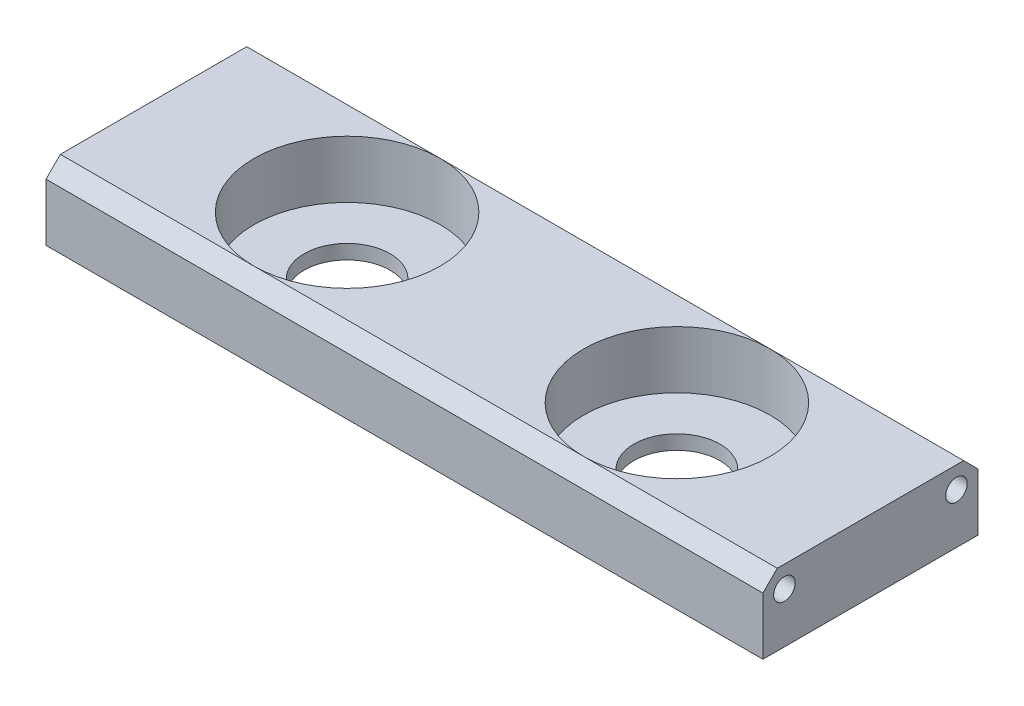
ISO-10303-21;
HEADER;
FILE_DESCRIPTION(('STEP AP214'),'2;1');
FILE_NAME('part.step','',(''),(''),'','','');
FILE_SCHEMA(('AUTOMOTIVE_DESIGN { 1 0 10303 214 1 1 1 1 }'));
ENDSEC;
DATA;
#1=APPLICATION_CONTEXT('core data for automotive mechanical design processes');
#2=APPLICATION_PROTOCOL_DEFINITION('international standard','automotive_design',2000,#1);
#3=PRODUCT_CONTEXT('',#1,'mechanical');
#4=PRODUCT('Part','Part','',(#3));
#5=PRODUCT_RELATED_PRODUCT_CATEGORY('part','',(#4));
#6=PRODUCT_DEFINITION_FORMATION('','',#4);
#7=PRODUCT_DEFINITION_CONTEXT('part definition',#1,'design');
#8=PRODUCT_DEFINITION('design','',#6,#7);
#9=PRODUCT_DEFINITION_SHAPE('','',#8);
#10=(LENGTH_UNIT() NAMED_UNIT(*) SI_UNIT(.MILLI.,.METRE.));
#11=(NAMED_UNIT(*) PLANE_ANGLE_UNIT() SI_UNIT($,.RADIAN.));
#12=(NAMED_UNIT(*) SI_UNIT($,.STERADIAN.) SOLID_ANGLE_UNIT());
#13=UNCERTAINTY_MEASURE_WITH_UNIT(LENGTH_MEASURE(1.E-05),#10,'distance_accuracy_value','');
#14=(GEOMETRIC_REPRESENTATION_CONTEXT(3) GLOBAL_UNCERTAINTY_ASSIGNED_CONTEXT((#13)) GLOBAL_UNIT_ASSIGNED_CONTEXT((#10,
#11,#12)) REPRESENTATION_CONTEXT('',''));
#15=CARTESIAN_POINT('',(0.,0.,0.));
#16=DIRECTION('',(0.,0.,1.));
#17=DIRECTION('',(1.,0.,0.));
#18=AXIS2_PLACEMENT_3D('',#15,#16,#17);
#19=CARTESIAN_POINT('',(0.,6.,0.));
#20=DIRECTION('',(0.,-1.,0.));
#21=DIRECTION('',(0.,0.,-1.));
#22=AXIS2_PLACEMENT_3D('',#19,#20,#21);
#23=PLANE('',#22);
#24=CARTESIAN_POINT('',(27.,6.,-15.));
#25=DIRECTION('',(0.,1.,0.));
#26=DIRECTION('',(0.,0.,1.));
#27=AXIS2_PLACEMENT_3D('',#24,#25,#26);
#28=CIRCLE('',#27,13.);
#29=CARTESIAN_POINT('',(27.,6.,-2.));
#30=VERTEX_POINT('',#29);
#31=CARTESIAN_POINT('',(27.,6.,-28.));
#32=VERTEX_POINT('',#31);
#33=EDGE_CURVE('E61',#30,#32,#28,.T.);
#34=ORIENTED_EDGE('',*,*,#33,.F.);
#35=DIRECTION('',(1.,0.,0.));
#36=VECTOR('',#35,1.);
#37=CARTESIAN_POINT('',(0.,6.,-2.));
#38=LINE('',#37,#36);
#39=CARTESIAN_POINT('',(73.,6.,-2.));
#40=VERTEX_POINT('',#39);
#41=EDGE_CURVE('E138',#30,#40,#38,.T.);
#42=ORIENTED_EDGE('',*,*,#41,.T.);
#43=CARTESIAN_POINT('',(73.,6.,-15.));
#44=DIRECTION('',(0.,1.,0.));
#45=DIRECTION('',(0.,0.,1.));
#46=AXIS2_PLACEMENT_3D('',#43,#44,#45);
#47=CIRCLE('',#46,13.);
#48=CARTESIAN_POINT('',(73.,6.,-28.));
#49=VERTEX_POINT('',#48);
#50=EDGE_CURVE('E115',#49,#40,#47,.T.);
#51=ORIENTED_EDGE('',*,*,#50,.F.);
#52=DIRECTION('',(-1.,0.,0.));
#53=VECTOR('',#52,1.);
#54=CARTESIAN_POINT('',(0.,6.,-28.));
#55=LINE('',#54,#53);
#56=EDGE_CURVE('E152',#49,#32,#55,.T.);
#57=ORIENTED_EDGE('',*,*,#56,.T.);
#58=EDGE_LOOP('',(#34,#42,#51,#57));
#59=FACE_BOUND('',#58,.T.);
#60=ADVANCED_FACE('F50',(#59),#23,.F.);
#61=EDGE_CURVE('E75',#40,#49,#47,.T.);
#62=ORIENTED_EDGE('',*,*,#61,.F.);
#63=CARTESIAN_POINT('',(100.,6.,-2.));
#64=VERTEX_POINT('',#63);
#65=EDGE_CURVE('E127',#40,#64,#38,.T.);
#66=ORIENTED_EDGE('',*,*,#65,.T.);
#67=DIRECTION('',(0.,0.,-1.));
#68=VECTOR('',#67,1.);
#69=CARTESIAN_POINT('',(100.,6.,0.));
#70=LINE('',#69,#68);
#71=CARTESIAN_POINT('',(100.,6.,-28.));
#72=VERTEX_POINT('',#71);
#73=EDGE_CURVE('E241',#64,#72,#70,.T.);
#74=ORIENTED_EDGE('',*,*,#73,.T.);
#75=EDGE_CURVE('E129',#72,#49,#55,.T.);
#76=ORIENTED_EDGE('',*,*,#75,.T.);
#77=EDGE_LOOP('',(#62,#66,#74,#76));
#78=FACE_BOUND('',#77,.T.);
#79=ADVANCED_FACE('F124',(#78),#23,.F.);
#80=CARTESIAN_POINT('',(73.,0.,-15.));
#81=DIRECTION('',(0.,1.,0.));
#82=DIRECTION('',(0.,0.,1.));
#83=AXIS2_PLACEMENT_3D('',#80,#81,#82);
#84=CYLINDRICAL_SURFACE('',#83,6.);
#85=CARTESIAN_POINT('',(73.,-4.,-15.));
#86=DIRECTION('',(0.,-1.,0.));
#87=DIRECTION('',(0.,0.,-1.));
#88=AXIS2_PLACEMENT_3D('',#85,#86,#87);
#89=CIRCLE('',#88,6.);
#90=CARTESIAN_POINT('',(73.,-4.,-21.));
#91=VERTEX_POINT('',#90);
#92=EDGE_CURVE('E171',#91,#91,#89,.T.);
#93=ORIENTED_EDGE('',*,*,#92,.T.);
#94=EDGE_LOOP('',(#93));
#95=FACE_BOUND('',#94,.T.);
#96=CARTESIAN_POINT('',(73.,-2.,-15.));
#97=DIRECTION('',(0.,1.,0.));
#98=DIRECTION('',(0.,0.,1.));
#99=AXIS2_PLACEMENT_3D('',#96,#97,#98);
#100=CIRCLE('',#99,6.);
#101=CARTESIAN_POINT('',(73.,-2.,-9.));
#102=VERTEX_POINT('',#101);
#103=EDGE_CURVE('E55',#102,#102,#100,.F.);
#104=ORIENTED_EDGE('',*,*,#103,.F.);
#105=EDGE_LOOP('',(#104));
#106=FACE_BOUND('',#105,.T.);
#107=ADVANCED_FACE('F307',(#95,#106),#84,.F.);
#108=CARTESIAN_POINT('',(27.,0.,-15.));
#109=DIRECTION('',(0.,1.,0.));
#110=DIRECTION('',(0.,0.,1.));
#111=AXIS2_PLACEMENT_3D('',#108,#109,#110);
#112=CYLINDRICAL_SURFACE('',#111,5.99999999999999);
#113=CARTESIAN_POINT('',(27.,-4.,-15.));
#114=DIRECTION('',(0.,-1.,0.));
#115=DIRECTION('',(0.,0.,-1.));
#116=AXIS2_PLACEMENT_3D('',#113,#114,#115);
#117=CIRCLE('',#116,5.99999999999999);
#118=CARTESIAN_POINT('',(27.,-4.,-21.));
#119=VERTEX_POINT('',#118);
#120=EDGE_CURVE('E190',#119,#119,#117,.T.);
#121=ORIENTED_EDGE('',*,*,#120,.T.);
#122=EDGE_LOOP('',(#121));
#123=FACE_BOUND('',#122,.T.);
#124=CARTESIAN_POINT('',(27.,-2.,-15.));
#125=DIRECTION('',(0.,1.,0.));
#126=DIRECTION('',(0.,0.,1.));
#127=AXIS2_PLACEMENT_3D('',#124,#125,#126);
#128=CIRCLE('',#127,5.99999999999999);
#129=CARTESIAN_POINT('',(27.,-2.,-9.00000000000001));
#130=VERTEX_POINT('',#129);
#131=EDGE_CURVE('E167',#130,#130,#128,.F.);
#132=ORIENTED_EDGE('',*,*,#131,.F.);
#133=EDGE_LOOP('',(#132));
#134=FACE_BOUND('',#133,.T.);
#135=ADVANCED_FACE('F324',(#123,#134),#112,.F.);
#136=CARTESIAN_POINT('',(0.,6.,0.));
#137=DIRECTION('',(1.,0.,0.));
#138=DIRECTION('',(0.,0.,-1.));
#139=AXIS2_PLACEMENT_3D('',#136,#137,#138);
#140=PLANE('',#139);
#141=CARTESIAN_POINT('',(0.,3.,-27.));
#142=DIRECTION('',(-1.,0.,0.));
#143=DIRECTION('',(0.,0.,1.));
#144=AXIS2_PLACEMENT_3D('',#141,#142,#143);
#145=CIRCLE('',#144,1.5);
#146=CARTESIAN_POINT('',(0.,3.,-25.5));
#147=VERTEX_POINT('',#146);
#148=EDGE_CURVE('E214',#147,#147,#145,.T.);
#149=ORIENTED_EDGE('',*,*,#148,.F.);
#150=EDGE_LOOP('',(#149));
#151=FACE_BOUND('',#150,.T.);
#152=CARTESIAN_POINT('',(0.,3.,-3.));
#153=DIRECTION('',(-1.,0.,0.));
#154=DIRECTION('',(0.,0.,1.));
#155=AXIS2_PLACEMENT_3D('',#152,#153,#154);
#156=CIRCLE('',#155,1.5);
#157=CARTESIAN_POINT('',(0.,3.,-1.5));
#158=VERTEX_POINT('',#157);
#159=EDGE_CURVE('E218',#158,#158,#156,.T.);
#160=ORIENTED_EDGE('',*,*,#159,.F.);
#161=EDGE_LOOP('',(#160));
#162=FACE_BOUND('',#161,.T.);
#163=DIRECTION('',(0.,0.,1.));
#164=VECTOR('',#163,1.);
#165=CARTESIAN_POINT('',(0.,6.,0.));
#166=LINE('',#165,#164);
#167=CARTESIAN_POINT('',(0.,6.,-28.));
#168=VERTEX_POINT('',#167);
#169=CARTESIAN_POINT('',(0.,6.,-2.));
#170=VERTEX_POINT('',#169);
#171=EDGE_CURVE('E226',#168,#170,#166,.T.);
#172=ORIENTED_EDGE('',*,*,#171,.F.);
#173=DIRECTION('',(0.,0.70710678118655,0.707106781186545));
#174=VECTOR('',#173,1.);
#175=CARTESIAN_POINT('',(0.,6.,-28.));
#176=LINE('',#175,#174);
#177=CARTESIAN_POINT('',(0.,4.,-30.));
#178=VERTEX_POINT('',#177);
#179=EDGE_CURVE('E160',#168,#178,#176,.F.);
#180=ORIENTED_EDGE('',*,*,#179,.T.);
#181=DIRECTION('',(0.,-1.,0.));
#182=VECTOR('',#181,1.);
#183=CARTESIAN_POINT('',(0.,6.,-30.));
#184=LINE('',#183,#182);
#185=CARTESIAN_POINT('',(0.,-4.,-30.));
#186=VERTEX_POINT('',#185);
#187=EDGE_CURVE('E246',#178,#186,#184,.T.);
#188=ORIENTED_EDGE('',*,*,#187,.T.);
#189=DIRECTION('',(0.,0.,-1.));
#190=VECTOR('',#189,1.);
#191=CARTESIAN_POINT('',(0.,-4.,0.));
#192=LINE('',#191,#190);
#193=CARTESIAN_POINT('',(0.,-4.,0.));
#194=VERTEX_POINT('',#193);
#195=EDGE_CURVE('E191',#194,#186,#192,.T.);
#196=ORIENTED_EDGE('',*,*,#195,.F.);
#197=DIRECTION('',(0.,-1.,0.));
#198=VECTOR('',#197,1.);
#199=CARTESIAN_POINT('',(0.,6.,0.));
#200=LINE('',#199,#198);
#201=CARTESIAN_POINT('',(0.,3.99999999999998,0.));
#202=VERTEX_POINT('',#201);
#203=EDGE_CURVE('E142',#202,#194,#200,.T.);
#204=ORIENTED_EDGE('',*,*,#203,.F.);
#205=DIRECTION('',(0.,-0.70710678118655,0.707106781186545));
#206=VECTOR('',#205,1.);
#207=CARTESIAN_POINT('',(0.,6.,-2.));
#208=LINE('',#207,#206);
#209=EDGE_CURVE('E153',#202,#170,#208,.F.);
#210=ORIENTED_EDGE('',*,*,#209,.T.);
#211=EDGE_LOOP('',(#172,#180,#188,#196,#204,#210));
#212=FACE_BOUND('',#211,.T.);
#213=ADVANCED_FACE('F267',(#151,#162,#212),#140,.F.);
#214=CARTESIAN_POINT('',(0.,6.,0.));
#215=DIRECTION('',(0.,0.,-1.));
#216=DIRECTION('',(-1.,0.,0.));
#217=AXIS2_PLACEMENT_3D('',#214,#215,#216);
#218=PLANE('',#217);
#219=DIRECTION('',(0.,-1.,0.));
#220=VECTOR('',#219,1.);
#221=CARTESIAN_POINT('',(100.,6.,0.));
#222=LINE('',#221,#220);
#223=CARTESIAN_POINT('',(100.,3.99999999999998,0.));
#224=VERTEX_POINT('',#223);
#225=CARTESIAN_POINT('',(100.,-4.,0.));
#226=VERTEX_POINT('',#225);
#227=EDGE_CURVE('E251',#224,#226,#222,.T.);
#228=ORIENTED_EDGE('',*,*,#227,.F.);
#229=DIRECTION('',(-1.,0.,0.));
#230=VECTOR('',#229,1.);
#231=CARTESIAN_POINT('',(0.,3.99999999999998,0.));
#232=LINE('',#231,#230);
#233=EDGE_CURVE('E11',#224,#202,#232,.T.);
#234=ORIENTED_EDGE('',*,*,#233,.T.);
#235=ORIENTED_EDGE('',*,*,#203,.T.);
#236=DIRECTION('',(-1.,0.,0.));
#237=VECTOR('',#236,1.);
#238=CARTESIAN_POINT('',(0.,-4.,0.));
#239=LINE('',#238,#237);
#240=EDGE_CURVE('E202',#226,#194,#239,.T.);
#241=ORIENTED_EDGE('',*,*,#240,.F.);
#242=EDGE_LOOP('',(#228,#234,#235,#241));
#243=FACE_BOUND('',#242,.T.);
#244=ADVANCED_FACE('F265',(#243),#218,.F.);
#245=CARTESIAN_POINT('',(100.,6.,0.));
#246=DIRECTION('',(-1.,0.,0.));
#247=DIRECTION('',(0.,0.,1.));
#248=AXIS2_PLACEMENT_3D('',#245,#246,#247);
#249=PLANE('',#248);
#250=CARTESIAN_POINT('',(100.,3.,-3.));
#251=DIRECTION('',(1.,0.,0.));
#252=DIRECTION('',(0.,0.,-1.));
#253=AXIS2_PLACEMENT_3D('',#250,#251,#252);
#254=CIRCLE('',#253,1.5);
#255=CARTESIAN_POINT('',(100.,3.,-4.5));
#256=VERTEX_POINT('',#255);
#257=EDGE_CURVE('E233',#256,#256,#254,.T.);
#258=ORIENTED_EDGE('',*,*,#257,.F.);
#259=EDGE_LOOP('',(#258));
#260=FACE_BOUND('',#259,.T.);
#261=CARTESIAN_POINT('',(100.,3.,-27.));
#262=DIRECTION('',(1.,0.,0.));
#263=DIRECTION('',(0.,0.,-1.));
#264=AXIS2_PLACEMENT_3D('',#261,#262,#263);
#265=CIRCLE('',#264,1.5);
#266=CARTESIAN_POINT('',(100.,3.,-28.5));
#267=VERTEX_POINT('',#266);
#268=EDGE_CURVE('E232',#267,#267,#265,.T.);
#269=ORIENTED_EDGE('',*,*,#268,.F.);
#270=EDGE_LOOP('',(#269));
#271=FACE_BOUND('',#270,.T.);
#272=DIRECTION('',(0.,-1.,0.));
#273=VECTOR('',#272,1.);
#274=CARTESIAN_POINT('',(100.,6.,-30.));
#275=LINE('',#274,#273);
#276=CARTESIAN_POINT('',(100.,4.,-30.));
#277=VERTEX_POINT('',#276);
#278=CARTESIAN_POINT('',(100.,-4.,-30.));
#279=VERTEX_POINT('',#278);
#280=EDGE_CURVE('E253',#277,#279,#275,.T.);
#281=ORIENTED_EDGE('',*,*,#280,.F.);
#282=DIRECTION('',(0.,-0.70710678118655,-0.707106781186545));
#283=VECTOR('',#282,1.);
#284=CARTESIAN_POINT('',(100.,6.,-28.));
#285=LINE('',#284,#283);
#286=EDGE_CURVE('E59',#277,#72,#285,.F.);
#287=ORIENTED_EDGE('',*,*,#286,.T.);
#288=ORIENTED_EDGE('',*,*,#73,.F.);
#289=DIRECTION('',(0.,0.70710678118655,-0.707106781186545));
#290=VECTOR('',#289,1.);
#291=CARTESIAN_POINT('',(100.,6.,-2.));
#292=LINE('',#291,#290);
#293=EDGE_CURVE('E139',#64,#224,#292,.F.);
#294=ORIENTED_EDGE('',*,*,#293,.T.);
#295=ORIENTED_EDGE('',*,*,#227,.T.);
#296=DIRECTION('',(0.,0.,1.));
#297=VECTOR('',#296,1.);
#298=CARTESIAN_POINT('',(100.,-4.,0.));
#299=LINE('',#298,#297);
#300=EDGE_CURVE('E203',#279,#226,#299,.T.);
#301=ORIENTED_EDGE('',*,*,#300,.F.);
#302=EDGE_LOOP('',(#281,#287,#288,#294,#295,#301));
#303=FACE_BOUND('',#302,.T.);
#304=ADVANCED_FACE('F280',(#260,#271,#303),#249,.F.);
#305=CARTESIAN_POINT('',(0.,6.,-30.));
#306=DIRECTION('',(0.,0.,1.));
#307=DIRECTION('',(1.,0.,0.));
#308=AXIS2_PLACEMENT_3D('',#305,#306,#307);
#309=PLANE('',#308);
#310=ORIENTED_EDGE('',*,*,#187,.F.);
#311=DIRECTION('',(1.,0.,0.));
#312=VECTOR('',#311,1.);
#313=CARTESIAN_POINT('',(0.,4.,-30.));
#314=LINE('',#313,#312);
#315=EDGE_CURVE('E159',#178,#277,#314,.T.);
#316=ORIENTED_EDGE('',*,*,#315,.T.);
#317=ORIENTED_EDGE('',*,*,#280,.T.);
#318=DIRECTION('',(1.,0.,0.));
#319=VECTOR('',#318,1.);
#320=CARTESIAN_POINT('',(0.,-4.,-30.));
#321=LINE('',#320,#319);
#322=EDGE_CURVE('E197',#186,#279,#321,.T.);
#323=ORIENTED_EDGE('',*,*,#322,.F.);
#324=EDGE_LOOP('',(#310,#316,#317,#323));
#325=FACE_BOUND('',#324,.T.);
#326=ADVANCED_FACE('F274',(#325),#309,.F.);
#327=EDGE_CURVE('E133',#32,#30,#28,.T.);
#328=ORIENTED_EDGE('',*,*,#327,.F.);
#329=EDGE_CURVE('E150',#32,#168,#55,.T.);
#330=ORIENTED_EDGE('',*,*,#329,.T.);
#331=ORIENTED_EDGE('',*,*,#171,.T.);
#332=EDGE_CURVE('E145',#170,#30,#38,.T.);
#333=ORIENTED_EDGE('',*,*,#332,.T.);
#334=EDGE_LOOP('',(#328,#330,#331,#333));
#335=FACE_BOUND('',#334,.T.);
#336=ADVANCED_FACE('F281',(#335),#23,.F.);
#337=CARTESIAN_POINT('',(0.,6.,-28.));
#338=DIRECTION('',(0.,-0.707106781186545,0.70710678118655));
#339=DIRECTION('',(-1.,0.,0.));
#340=AXIS2_PLACEMENT_3D('',#337,#338,#339);
#341=PLANE('',#340);
#342=ORIENTED_EDGE('',*,*,#286,.F.);
#343=ORIENTED_EDGE('',*,*,#315,.F.);
#344=ORIENTED_EDGE('',*,*,#179,.F.);
#345=ORIENTED_EDGE('',*,*,#329,.F.);
#346=ORIENTED_EDGE('',*,*,#56,.F.);
#347=ORIENTED_EDGE('',*,*,#75,.F.);
#348=EDGE_LOOP('',(#342,#343,#344,#345,#346,#347));
#349=FACE_BOUND('',#348,.T.);
#350=ADVANCED_FACE('F278',(#349),#341,.F.);
#351=CARTESIAN_POINT('',(0.,6.,-2.));
#352=DIRECTION('',(0.,-0.707106781186545,-0.70710678118655));
#353=DIRECTION('',(1.,0.,0.));
#354=AXIS2_PLACEMENT_3D('',#351,#352,#353);
#355=PLANE('',#354);
#356=ORIENTED_EDGE('',*,*,#209,.F.);
#357=ORIENTED_EDGE('',*,*,#233,.F.);
#358=ORIENTED_EDGE('',*,*,#293,.F.);
#359=ORIENTED_EDGE('',*,*,#65,.F.);
#360=ORIENTED_EDGE('',*,*,#41,.F.);
#361=ORIENTED_EDGE('',*,*,#332,.F.);
#362=EDGE_LOOP('',(#356,#357,#358,#359,#360,#361));
#363=FACE_BOUND('',#362,.T.);
#364=ADVANCED_FACE('F49',(#363),#355,.F.);
#365=CARTESIAN_POINT('',(93.,3.,-27.));
#366=DIRECTION('',(1.,0.,0.));
#367=DIRECTION('',(0.,0.,-1.));
#368=AXIS2_PLACEMENT_3D('',#365,#366,#367);
#369=CYLINDRICAL_SURFACE('',#368,1.5);
#370=CARTESIAN_POINT('',(93.,3.,-27.));
#371=DIRECTION('',(1.,0.,0.));
#372=DIRECTION('',(0.,0.,-1.));
#373=AXIS2_PLACEMENT_3D('',#370,#371,#372);
#374=CIRCLE('',#373,1.5);
#375=CARTESIAN_POINT('',(93.,3.,-28.5));
#376=VERTEX_POINT('',#375);
#377=EDGE_CURVE('E212',#376,#376,#374,.T.);
#378=ORIENTED_EDGE('',*,*,#377,.F.);
#379=EDGE_LOOP('',(#378));
#380=FACE_BOUND('',#379,.T.);
#381=ORIENTED_EDGE('',*,*,#268,.T.);
#382=EDGE_LOOP('',(#381));
#383=FACE_BOUND('',#382,.T.);
#384=ADVANCED_FACE('F364',(#380,#383),#369,.F.);
#385=CARTESIAN_POINT('',(93.,3.,-27.));
#386=DIRECTION('',(1.,0.,0.));
#387=DIRECTION('',(0.,0.,-1.));
#388=AXIS2_PLACEMENT_3D('',#385,#386,#387);
#389=PLANE('',#388);
#390=ORIENTED_EDGE('',*,*,#377,.T.);
#391=EDGE_LOOP('',(#390));
#392=FACE_BOUND('',#391,.T.);
#393=ADVANCED_FACE('F361',(#392),#389,.T.);
#394=CARTESIAN_POINT('',(93.,3.,-3.));
#395=DIRECTION('',(1.,0.,0.));
#396=DIRECTION('',(0.,0.,-1.));
#397=AXIS2_PLACEMENT_3D('',#394,#395,#396);
#398=CYLINDRICAL_SURFACE('',#397,1.5);
#399=CARTESIAN_POINT('',(93.,3.,-3.));
#400=DIRECTION('',(1.,0.,0.));
#401=DIRECTION('',(0.,0.,-1.));
#402=AXIS2_PLACEMENT_3D('',#399,#400,#401);
#403=CIRCLE('',#402,1.5);
#404=CARTESIAN_POINT('',(93.,3.,-4.5));
#405=VERTEX_POINT('',#404);
#406=EDGE_CURVE('E228',#405,#405,#403,.T.);
#407=ORIENTED_EDGE('',*,*,#406,.F.);
#408=EDGE_LOOP('',(#407));
#409=FACE_BOUND('',#408,.T.);
#410=ORIENTED_EDGE('',*,*,#257,.T.);
#411=EDGE_LOOP('',(#410));
#412=FACE_BOUND('',#411,.T.);
#413=ADVANCED_FACE('F355',(#409,#412),#398,.F.);
#414=CARTESIAN_POINT('',(93.,3.,-3.));
#415=DIRECTION('',(1.,0.,0.));
#416=DIRECTION('',(0.,0.,-1.));
#417=AXIS2_PLACEMENT_3D('',#414,#415,#416);
#418=PLANE('',#417);
#419=ORIENTED_EDGE('',*,*,#406,.T.);
#420=EDGE_LOOP('',(#419));
#421=FACE_BOUND('',#420,.T.);
#422=ADVANCED_FACE('F344',(#421),#418,.T.);
#423=CARTESIAN_POINT('',(7.,3.,-3.));
#424=DIRECTION('',(-1.,0.,0.));
#425=DIRECTION('',(0.,0.,1.));
#426=AXIS2_PLACEMENT_3D('',#423,#424,#425);
#427=CYLINDRICAL_SURFACE('',#426,1.5);
#428=CARTESIAN_POINT('',(7.,3.,-3.));
#429=DIRECTION('',(-1.,0.,0.));
#430=DIRECTION('',(0.,0.,1.));
#431=AXIS2_PLACEMENT_3D('',#428,#429,#430);
#432=CIRCLE('',#431,1.5);
#433=CARTESIAN_POINT('',(7.,3.,-1.5));
#434=VERTEX_POINT('',#433);
#435=EDGE_CURVE('E207',#434,#434,#432,.T.);
#436=ORIENTED_EDGE('',*,*,#435,.F.);
#437=EDGE_LOOP('',(#436));
#438=FACE_BOUND('',#437,.T.);
#439=ORIENTED_EDGE('',*,*,#159,.T.);
#440=EDGE_LOOP('',(#439));
#441=FACE_BOUND('',#440,.T.);
#442=ADVANCED_FACE('F343',(#438,#441),#427,.F.);
#443=CARTESIAN_POINT('',(7.,3.,-3.));
#444=DIRECTION('',(-1.,0.,0.));
#445=DIRECTION('',(0.,0.,1.));
#446=AXIS2_PLACEMENT_3D('',#443,#444,#445);
#447=PLANE('',#446);
#448=ORIENTED_EDGE('',*,*,#435,.T.);
#449=EDGE_LOOP('',(#448));
#450=FACE_BOUND('',#449,.T.);
#451=ADVANCED_FACE('F341',(#450),#447,.T.);
#452=CARTESIAN_POINT('',(7.,3.,-27.));
#453=DIRECTION('',(-1.,0.,0.));
#454=DIRECTION('',(0.,0.,1.));
#455=AXIS2_PLACEMENT_3D('',#452,#453,#454);
#456=CYLINDRICAL_SURFACE('',#455,1.5);
#457=CARTESIAN_POINT('',(7.,3.,-27.));
#458=DIRECTION('',(-1.,0.,0.));
#459=DIRECTION('',(0.,0.,1.));
#460=AXIS2_PLACEMENT_3D('',#457,#458,#459);
#461=CIRCLE('',#460,1.5);
#462=CARTESIAN_POINT('',(7.,3.,-25.5));
#463=VERTEX_POINT('',#462);
#464=EDGE_CURVE('E209',#463,#463,#461,.T.);
#465=ORIENTED_EDGE('',*,*,#464,.F.);
#466=EDGE_LOOP('',(#465));
#467=FACE_BOUND('',#466,.T.);
#468=ORIENTED_EDGE('',*,*,#148,.T.);
#469=EDGE_LOOP('',(#468));
#470=FACE_BOUND('',#469,.T.);
#471=ADVANCED_FACE('F353',(#467,#470),#456,.F.);
#472=CARTESIAN_POINT('',(7.,3.,-27.));
#473=DIRECTION('',(-1.,0.,0.));
#474=DIRECTION('',(0.,0.,1.));
#475=AXIS2_PLACEMENT_3D('',#472,#473,#474);
#476=PLANE('',#475);
#477=ORIENTED_EDGE('',*,*,#464,.T.);
#478=EDGE_LOOP('',(#477));
#479=FACE_BOUND('',#478,.T.);
#480=ADVANCED_FACE('F377',(#479),#476,.T.);
#481=CARTESIAN_POINT('',(0.,-4.,0.));
#482=DIRECTION('',(0.,-1.,0.));
#483=DIRECTION('',(0.,0.,-1.));
#484=AXIS2_PLACEMENT_3D('',#481,#482,#483);
#485=PLANE('',#484);
#486=ORIENTED_EDGE('',*,*,#120,.F.);
#487=EDGE_LOOP('',(#486));
#488=FACE_BOUND('',#487,.T.);
#489=ORIENTED_EDGE('',*,*,#195,.T.);
#490=ORIENTED_EDGE('',*,*,#322,.T.);
#491=ORIENTED_EDGE('',*,*,#300,.T.);
#492=ORIENTED_EDGE('',*,*,#240,.T.);
#493=EDGE_LOOP('',(#489,#490,#491,#492));
#494=FACE_BOUND('',#493,.T.);
#495=ORIENTED_EDGE('',*,*,#92,.F.);
#496=EDGE_LOOP('',(#495));
#497=FACE_BOUND('',#496,.T.);
#498=ADVANCED_FACE('F266',(#488,#494,#497),#485,.T.);
#499=CARTESIAN_POINT('',(27.,-2.,-15.));
#500=DIRECTION('',(0.,1.,0.));
#501=DIRECTION('',(0.,0.,1.));
#502=AXIS2_PLACEMENT_3D('',#499,#500,#501);
#503=PLANE('',#502);
#504=CARTESIAN_POINT('',(27.,-2.,-15.));
#505=DIRECTION('',(0.,1.,0.));
#506=DIRECTION('',(0.,0.,1.));
#507=AXIS2_PLACEMENT_3D('',#504,#505,#506);
#508=CIRCLE('',#507,13.);
#509=CARTESIAN_POINT('',(27.,-2.,-2.00000000000001));
#510=VERTEX_POINT('',#509);
#511=EDGE_CURVE('E166',#510,#510,#508,.T.);
#512=ORIENTED_EDGE('',*,*,#511,.T.);
#513=EDGE_LOOP('',(#512));
#514=FACE_BOUND('',#513,.T.);
#515=ORIENTED_EDGE('',*,*,#131,.T.);
#516=EDGE_LOOP('',(#515));
#517=FACE_BOUND('',#516,.T.);
#518=ADVANCED_FACE('F287',(#514,#517),#503,.T.);
#519=CARTESIAN_POINT('',(27.,-2.,-15.));
#520=DIRECTION('',(0.,1.,0.));
#521=DIRECTION('',(0.,0.,1.));
#522=AXIS2_PLACEMENT_3D('',#519,#520,#521);
#523=CYLINDRICAL_SURFACE('',#522,13.);
#524=ORIENTED_EDGE('',*,*,#511,.F.);
#525=EDGE_LOOP('',(#524));
#526=FACE_BOUND('',#525,.T.);
#527=ORIENTED_EDGE('',*,*,#33,.T.);
#528=ORIENTED_EDGE('',*,*,#327,.T.);
#529=EDGE_LOOP('',(#527,#528));
#530=FACE_BOUND('',#529,.T.);
#531=ADVANCED_FACE('F290',(#526,#530),#523,.F.);
#532=CARTESIAN_POINT('',(73.,-2.,-15.));
#533=DIRECTION('',(0.,1.,0.));
#534=DIRECTION('',(0.,0.,1.));
#535=AXIS2_PLACEMENT_3D('',#532,#533,#534);
#536=PLANE('',#535);
#537=CARTESIAN_POINT('',(73.,-2.,-15.));
#538=DIRECTION('',(0.,1.,0.));
#539=DIRECTION('',(0.,0.,1.));
#540=AXIS2_PLACEMENT_3D('',#537,#538,#539);
#541=CIRCLE('',#540,13.);
#542=CARTESIAN_POINT('',(73.,-2.,-2.));
#543=VERTEX_POINT('',#542);
#544=EDGE_CURVE('E120',#543,#543,#541,.T.);
#545=ORIENTED_EDGE('',*,*,#544,.T.);
#546=EDGE_LOOP('',(#545));
#547=FACE_BOUND('',#546,.T.);
#548=ORIENTED_EDGE('',*,*,#103,.T.);
#549=EDGE_LOOP('',(#548));
#550=FACE_BOUND('',#549,.T.);
#551=ADVANCED_FACE('F289',(#547,#550),#536,.T.);
#552=CARTESIAN_POINT('',(73.,-2.,-15.));
#553=DIRECTION('',(0.,1.,0.));
#554=DIRECTION('',(0.,0.,1.));
#555=AXIS2_PLACEMENT_3D('',#552,#553,#554);
#556=CYLINDRICAL_SURFACE('',#555,13.);
#557=ORIENTED_EDGE('',*,*,#544,.F.);
#558=EDGE_LOOP('',(#557));
#559=FACE_BOUND('',#558,.T.);
#560=ORIENTED_EDGE('',*,*,#61,.T.);
#561=ORIENTED_EDGE('',*,*,#50,.T.);
#562=EDGE_LOOP('',(#560,#561));
#563=FACE_BOUND('',#562,.T.);
#564=ADVANCED_FACE('F114',(#559,#563),#556,.F.);
#565=CLOSED_SHELL('',(#60,#79,#107,#135,#213,#244,#304,#326,#336,#350,#364,#384,#393,#413,#422,
#442,#451,#471,#480,#498,#518,#531,#551,#564));
#566=MANIFOLD_SOLID_BREP('B2',#565);
#567=ADVANCED_BREP_SHAPE_REPRESENTATION('',(#18,#566),#14);
#568=SHAPE_DEFINITION_REPRESENTATION(#9,#567);
ENDSEC;
END-ISO-10303-21;
